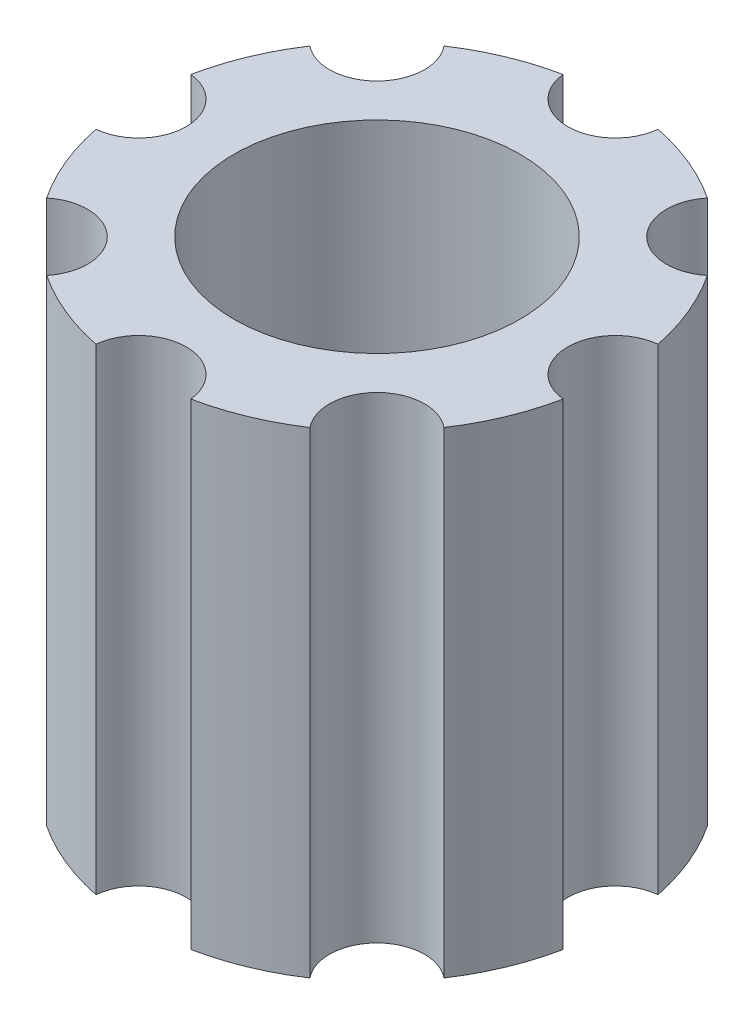
ISO-10303-21;
HEADER;
FILE_DESCRIPTION(('STEP AP214'),'2;1');
FILE_NAME('part.step','',(''),(''),'','','');
FILE_SCHEMA(('AUTOMOTIVE_DESIGN { 1 0 10303 214 1 1 1 1 }'));
ENDSEC;
DATA;
#1=APPLICATION_CONTEXT('core data for automotive mechanical design processes');
#2=APPLICATION_PROTOCOL_DEFINITION('international standard','automotive_design',2000,#1);
#3=PRODUCT_CONTEXT('',#1,'mechanical');
#4=PRODUCT('Part','Part','',(#3));
#5=PRODUCT_RELATED_PRODUCT_CATEGORY('part','',(#4));
#6=PRODUCT_DEFINITION_FORMATION('','',#4);
#7=PRODUCT_DEFINITION_CONTEXT('part definition',#1,'design');
#8=PRODUCT_DEFINITION('design','',#6,#7);
#9=PRODUCT_DEFINITION_SHAPE('','',#8);
#10=(LENGTH_UNIT() NAMED_UNIT(*) SI_UNIT(.MILLI.,.METRE.));
#11=(NAMED_UNIT(*) PLANE_ANGLE_UNIT() SI_UNIT($,.RADIAN.));
#12=(NAMED_UNIT(*) SI_UNIT($,.STERADIAN.) SOLID_ANGLE_UNIT());
#13=UNCERTAINTY_MEASURE_WITH_UNIT(LENGTH_MEASURE(1.E-05),#10,'distance_accuracy_value','');
#14=(GEOMETRIC_REPRESENTATION_CONTEXT(3) GLOBAL_UNCERTAINTY_ASSIGNED_CONTEXT((#13)) GLOBAL_UNIT_ASSIGNED_CONTEXT((#10,
#11,#12)) REPRESENTATION_CONTEXT('',''));
#15=CARTESIAN_POINT('',(0.,0.,0.));
#16=DIRECTION('',(0.,0.,1.));
#17=DIRECTION('',(1.,0.,0.));
#18=AXIS2_PLACEMENT_3D('',#15,#16,#17);
#19=CARTESIAN_POINT('',(0.,5.,0.));
#20=DIRECTION('',(0.,-1.,0.));
#21=DIRECTION('',(0.,0.,-1.));
#22=AXIS2_PLACEMENT_3D('',#19,#20,#21);
#23=CYLINDRICAL_SURFACE('',#22,2.5);
#24=CARTESIAN_POINT('',(0.,0.,0.));
#25=DIRECTION('',(0.,1.,0.));
#26=DIRECTION('',(0.,0.,1.));
#27=AXIS2_PLACEMENT_3D('',#24,#25,#26);
#28=CIRCLE('',#27,2.5);
#29=CARTESIAN_POINT('',(-2.08419279589379,0.,-1.38063043192029));
#30=VERTEX_POINT('',#29);
#31=CARTESIAN_POINT('',(-2.45,0.,-0.497493718553308));
#32=VERTEX_POINT('',#31);
#33=EDGE_CURVE('E204',#30,#32,#28,.T.);
#34=ORIENTED_EDGE('',*,*,#33,.T.);
#35=DIRECTION('',(0.,-1.,0.));
#36=VECTOR('',#35,1.);
#37=CARTESIAN_POINT('',(-2.45,5.,-0.497493718553308));
#38=LINE('',#37,#36);
#39=CARTESIAN_POINT('',(-2.45,5.,-0.497493718553308));
#40=VERTEX_POINT('',#39);
#41=EDGE_CURVE('E11',#40,#32,#38,.T.);
#42=ORIENTED_EDGE('',*,*,#41,.F.);
#43=CARTESIAN_POINT('',(0.,5.,0.));
#44=DIRECTION('',(0.,1.,0.));
#45=DIRECTION('',(0.,0.,1.));
#46=AXIS2_PLACEMENT_3D('',#43,#44,#45);
#47=CIRCLE('',#46,2.5);
#48=CARTESIAN_POINT('',(-2.08419279589379,5.,-1.38063043192029));
#49=VERTEX_POINT('',#48);
#50=EDGE_CURVE('E175',#49,#40,#47,.T.);
#51=ORIENTED_EDGE('',*,*,#50,.F.);
#52=DIRECTION('',(0.,-1.,0.));
#53=VECTOR('',#52,1.);
#54=CARTESIAN_POINT('',(-2.08419279589379,5.,-1.38063043192029));
#55=LINE('',#54,#53);
#56=EDGE_CURVE('E176',#49,#30,#55,.T.);
#57=ORIENTED_EDGE('',*,*,#56,.T.);
#58=EDGE_LOOP('',(#34,#42,#51,#57));
#59=FACE_BOUND('',#58,.T.);
#60=ADVANCED_FACE('F34',(#59),#23,.T.);
#61=CARTESIAN_POINT('',(-2.5,5.,0.));
#62=DIRECTION('',(0.,-1.,0.));
#63=DIRECTION('',(0.,0.,-1.));
#64=AXIS2_PLACEMENT_3D('',#61,#62,#63);
#65=CYLINDRICAL_SURFACE('',#64,0.5);
#66=CARTESIAN_POINT('',(-2.5,0.,0.));
#67=DIRECTION('',(0.,1.,0.));
#68=DIRECTION('',(0.,0.,1.));
#69=AXIS2_PLACEMENT_3D('',#66,#67,#68);
#70=CIRCLE('',#69,0.5);
#71=CARTESIAN_POINT('',(-2.45,0.,0.497493718553308));
#72=VERTEX_POINT('',#71);
#73=EDGE_CURVE('E207',#32,#72,#70,.F.);
#74=ORIENTED_EDGE('',*,*,#73,.T.);
#75=DIRECTION('',(0.,-1.,0.));
#76=VECTOR('',#75,1.);
#77=CARTESIAN_POINT('',(-2.45,5.,0.497493718553308));
#78=LINE('',#77,#76);
#79=CARTESIAN_POINT('',(-2.45,5.,0.497493718553308));
#80=VERTEX_POINT('',#79);
#81=EDGE_CURVE('E43',#80,#72,#78,.T.);
#82=ORIENTED_EDGE('',*,*,#81,.F.);
#83=CARTESIAN_POINT('',(-2.5,5.,0.));
#84=DIRECTION('',(0.,1.,0.));
#85=DIRECTION('',(0.,0.,1.));
#86=AXIS2_PLACEMENT_3D('',#83,#84,#85);
#87=CIRCLE('',#86,0.5);
#88=EDGE_CURVE('E118',#40,#80,#87,.F.);
#89=ORIENTED_EDGE('',*,*,#88,.F.);
#90=ORIENTED_EDGE('',*,*,#41,.T.);
#91=EDGE_LOOP('',(#74,#82,#89,#90));
#92=FACE_BOUND('',#91,.T.);
#93=ADVANCED_FACE('F325',(#92),#65,.F.);
#94=CARTESIAN_POINT('',(0.,5.,0.));
#95=DIRECTION('',(0.,-1.,0.));
#96=DIRECTION('',(0.,0.,-1.));
#97=AXIS2_PLACEMENT_3D('',#94,#95,#96);
#98=CYLINDRICAL_SURFACE('',#97,2.5);
#99=CARTESIAN_POINT('',(0.,0.,0.));
#100=DIRECTION('',(0.,1.,0.));
#101=DIRECTION('',(0.,0.,1.));
#102=AXIS2_PLACEMENT_3D('',#99,#100,#101);
#103=CIRCLE('',#102,2.5);
#104=CARTESIAN_POINT('',(-2.08419279589381,0.,1.38063043192026));
#105=VERTEX_POINT('',#104);
#106=EDGE_CURVE('E210',#72,#105,#103,.T.);
#107=ORIENTED_EDGE('',*,*,#106,.T.);
#108=DIRECTION('',(0.,-1.,0.));
#109=VECTOR('',#108,1.);
#110=CARTESIAN_POINT('',(-2.08419279589381,5.,1.38063043192026));
#111=LINE('',#110,#109);
#112=CARTESIAN_POINT('',(-2.08419279589381,5.,1.38063043192026));
#113=VERTEX_POINT('',#112);
#114=EDGE_CURVE('E258',#113,#105,#111,.T.);
#115=ORIENTED_EDGE('',*,*,#114,.F.);
#116=CARTESIAN_POINT('',(0.,5.,0.));
#117=DIRECTION('',(0.,1.,0.));
#118=DIRECTION('',(0.,0.,1.));
#119=AXIS2_PLACEMENT_3D('',#116,#117,#118);
#120=CIRCLE('',#119,2.5);
#121=EDGE_CURVE('E185',#80,#113,#120,.T.);
#122=ORIENTED_EDGE('',*,*,#121,.F.);
#123=ORIENTED_EDGE('',*,*,#81,.T.);
#124=EDGE_LOOP('',(#107,#115,#122,#123));
#125=FACE_BOUND('',#124,.T.);
#126=ADVANCED_FACE('F264',(#125),#98,.T.);
#127=CARTESIAN_POINT('',(-1.76776695296639,5.,1.76776695296635));
#128=DIRECTION('',(0.,-1.,0.));
#129=DIRECTION('',(0.,0.,-1.));
#130=AXIS2_PLACEMENT_3D('',#127,#128,#129);
#131=CYLINDRICAL_SURFACE('',#130,0.5);
#132=CARTESIAN_POINT('',(-1.76776695296639,0.,1.76776695296635));
#133=DIRECTION('',(0.,1.,0.));
#134=DIRECTION('',(0.,0.,1.));
#135=AXIS2_PLACEMENT_3D('',#132,#133,#134);
#136=CIRCLE('',#135,0.5);
#137=CARTESIAN_POINT('',(-1.38063043192031,0.,2.08419279589378));
#138=VERTEX_POINT('',#137);
#139=EDGE_CURVE('E212',#105,#138,#136,.F.);
#140=ORIENTED_EDGE('',*,*,#139,.T.);
#141=DIRECTION('',(0.,-1.,0.));
#142=VECTOR('',#141,1.);
#143=CARTESIAN_POINT('',(-1.38063043192031,5.,2.08419279589378));
#144=LINE('',#143,#142);
#145=CARTESIAN_POINT('',(-1.38063043192031,5.,2.08419279589378));
#146=VERTEX_POINT('',#145);
#147=EDGE_CURVE('E255',#146,#138,#144,.T.);
#148=ORIENTED_EDGE('',*,*,#147,.F.);
#149=CARTESIAN_POINT('',(-1.76776695296639,5.,1.76776695296635));
#150=DIRECTION('',(0.,1.,0.));
#151=DIRECTION('',(0.,0.,1.));
#152=AXIS2_PLACEMENT_3D('',#149,#150,#151);
#153=CIRCLE('',#152,0.5);
#154=EDGE_CURVE('E283',#113,#146,#153,.F.);
#155=ORIENTED_EDGE('',*,*,#154,.F.);
#156=ORIENTED_EDGE('',*,*,#114,.T.);
#157=EDGE_LOOP('',(#140,#148,#155,#156));
#158=FACE_BOUND('',#157,.T.);
#159=ADVANCED_FACE('F274',(#158),#131,.F.);
#160=CARTESIAN_POINT('',(-0.497493718553334,0.,2.44999999999999));
#161=VERTEX_POINT('',#160);
#162=EDGE_CURVE('E214',#138,#161,#103,.T.);
#163=ORIENTED_EDGE('',*,*,#162,.T.);
#164=DIRECTION('',(0.,-1.,0.));
#165=VECTOR('',#164,1.);
#166=CARTESIAN_POINT('',(-0.497493718553334,5.,2.44999999999999));
#167=LINE('',#166,#165);
#168=CARTESIAN_POINT('',(-0.497493718553334,5.,2.44999999999999));
#169=VERTEX_POINT('',#168);
#170=EDGE_CURVE('E252',#169,#161,#167,.T.);
#171=ORIENTED_EDGE('',*,*,#170,.F.);
#172=EDGE_CURVE('E280',#146,#169,#120,.T.);
#173=ORIENTED_EDGE('',*,*,#172,.F.);
#174=ORIENTED_EDGE('',*,*,#147,.T.);
#175=EDGE_LOOP('',(#163,#171,#173,#174));
#176=FACE_BOUND('',#175,.T.);
#177=ADVANCED_FACE('F278',(#176),#98,.T.);
#178=CARTESIAN_POINT('',(0.,5.,2.5));
#179=DIRECTION('',(0.,-1.,0.));
#180=DIRECTION('',(0.,0.,-1.));
#181=AXIS2_PLACEMENT_3D('',#178,#179,#180);
#182=CYLINDRICAL_SURFACE('',#181,0.5);
#183=CARTESIAN_POINT('',(0.,0.,2.5));
#184=DIRECTION('',(0.,1.,0.));
#185=DIRECTION('',(0.,0.,1.));
#186=AXIS2_PLACEMENT_3D('',#183,#184,#185);
#187=CIRCLE('',#186,0.5);
#188=CARTESIAN_POINT('',(0.497493718553282,0.,2.45000000000001));
#189=VERTEX_POINT('',#188);
#190=EDGE_CURVE('E216',#161,#189,#187,.F.);
#191=ORIENTED_EDGE('',*,*,#190,.T.);
#192=DIRECTION('',(0.,-1.,0.));
#193=VECTOR('',#192,1.);
#194=CARTESIAN_POINT('',(0.497493718553282,5.,2.45000000000001));
#195=LINE('',#194,#193);
#196=CARTESIAN_POINT('',(0.497493718553282,5.,2.45000000000001));
#197=VERTEX_POINT('',#196);
#198=EDGE_CURVE('E249',#197,#189,#195,.T.);
#199=ORIENTED_EDGE('',*,*,#198,.F.);
#200=CARTESIAN_POINT('',(0.,5.,2.5));
#201=DIRECTION('',(0.,1.,0.));
#202=DIRECTION('',(0.,0.,1.));
#203=AXIS2_PLACEMENT_3D('',#200,#201,#202);
#204=CIRCLE('',#203,0.5);
#205=EDGE_CURVE('E282',#169,#197,#204,.F.);
#206=ORIENTED_EDGE('',*,*,#205,.F.);
#207=ORIENTED_EDGE('',*,*,#170,.T.);
#208=EDGE_LOOP('',(#191,#199,#206,#207));
#209=FACE_BOUND('',#208,.T.);
#210=ADVANCED_FACE('F350',(#209),#182,.F.);
#211=CARTESIAN_POINT('',(1.38063043192027,0.,2.08419279589381));
#212=VERTEX_POINT('',#211);
#213=EDGE_CURVE('E218',#189,#212,#103,.T.);
#214=ORIENTED_EDGE('',*,*,#213,.T.);
#215=DIRECTION('',(0.,-1.,0.));
#216=VECTOR('',#215,1.);
#217=CARTESIAN_POINT('',(1.38063043192027,5.,2.08419279589381));
#218=LINE('',#217,#216);
#219=CARTESIAN_POINT('',(1.38063043192027,5.,2.08419279589381));
#220=VERTEX_POINT('',#219);
#221=EDGE_CURVE('E246',#220,#212,#218,.T.);
#222=ORIENTED_EDGE('',*,*,#221,.F.);
#223=EDGE_CURVE('E197',#197,#220,#120,.T.);
#224=ORIENTED_EDGE('',*,*,#223,.F.);
#225=ORIENTED_EDGE('',*,*,#198,.T.);
#226=EDGE_LOOP('',(#214,#222,#224,#225));
#227=FACE_BOUND('',#226,.T.);
#228=ADVANCED_FACE('F347',(#227),#98,.T.);
#229=CARTESIAN_POINT('',(1.76776695296635,5.,1.76776695296638));
#230=DIRECTION('',(0.,-1.,0.));
#231=DIRECTION('',(0.,0.,-1.));
#232=AXIS2_PLACEMENT_3D('',#229,#230,#231);
#233=CYLINDRICAL_SURFACE('',#232,0.5);
#234=CARTESIAN_POINT('',(1.76776695296635,0.,1.76776695296638));
#235=DIRECTION('',(0.,1.,0.));
#236=DIRECTION('',(0.,0.,1.));
#237=AXIS2_PLACEMENT_3D('',#234,#235,#236);
#238=CIRCLE('',#237,0.5);
#239=CARTESIAN_POINT('',(2.08419279589379,0.,1.3806304319203));
#240=VERTEX_POINT('',#239);
#241=EDGE_CURVE('E219',#212,#240,#238,.F.);
#242=ORIENTED_EDGE('',*,*,#241,.T.);
#243=DIRECTION('',(0.,-1.,0.));
#244=VECTOR('',#243,1.);
#245=CARTESIAN_POINT('',(2.08419279589379,5.,1.3806304319203));
#246=LINE('',#245,#244);
#247=CARTESIAN_POINT('',(2.08419279589379,5.,1.3806304319203));
#248=VERTEX_POINT('',#247);
#249=EDGE_CURVE('E243',#248,#240,#246,.T.);
#250=ORIENTED_EDGE('',*,*,#249,.F.);
#251=CARTESIAN_POINT('',(1.76776695296635,5.,1.76776695296638));
#252=DIRECTION('',(0.,1.,0.));
#253=DIRECTION('',(0.,0.,1.));
#254=AXIS2_PLACEMENT_3D('',#251,#252,#253);
#255=CIRCLE('',#254,0.5);
#256=EDGE_CURVE('E195',#220,#248,#255,.F.);
#257=ORIENTED_EDGE('',*,*,#256,.F.);
#258=ORIENTED_EDGE('',*,*,#221,.T.);
#259=EDGE_LOOP('',(#242,#250,#257,#258));
#260=FACE_BOUND('',#259,.T.);
#261=ADVANCED_FACE('F292',(#260),#233,.F.);
#262=CARTESIAN_POINT('',(2.45,0.,0.497493718553325));
#263=VERTEX_POINT('',#262);
#264=EDGE_CURVE('E213',#240,#263,#103,.T.);
#265=ORIENTED_EDGE('',*,*,#264,.T.);
#266=DIRECTION('',(0.,-1.,0.));
#267=VECTOR('',#266,1.);
#268=CARTESIAN_POINT('',(2.45,5.,0.497493718553325));
#269=LINE('',#268,#267);
#270=CARTESIAN_POINT('',(2.45,5.,0.497493718553325));
#271=VERTEX_POINT('',#270);
#272=EDGE_CURVE('E240',#271,#263,#269,.T.);
#273=ORIENTED_EDGE('',*,*,#272,.F.);
#274=EDGE_CURVE('E191',#248,#271,#120,.T.);
#275=ORIENTED_EDGE('',*,*,#274,.F.);
#276=ORIENTED_EDGE('',*,*,#249,.T.);
#277=EDGE_LOOP('',(#265,#273,#275,#276));
#278=FACE_BOUND('',#277,.T.);
#279=ADVANCED_FACE('F296',(#278),#98,.T.);
#280=CARTESIAN_POINT('',(2.5,5.,0.));
#281=DIRECTION('',(0.,-1.,0.));
#282=DIRECTION('',(0.,0.,-1.));
#283=AXIS2_PLACEMENT_3D('',#280,#281,#282);
#284=CYLINDRICAL_SURFACE('',#283,0.5);
#285=CARTESIAN_POINT('',(2.5,0.,0.));
#286=DIRECTION('',(0.,1.,0.));
#287=DIRECTION('',(0.,0.,1.));
#288=AXIS2_PLACEMENT_3D('',#285,#286,#287);
#289=CIRCLE('',#288,0.5);
#290=CARTESIAN_POINT('',(2.45,0.,-0.497493718553291));
#291=VERTEX_POINT('',#290);
#292=EDGE_CURVE('E221',#263,#291,#289,.F.);
#293=ORIENTED_EDGE('',*,*,#292,.T.);
#294=DIRECTION('',(0.,-1.,0.));
#295=VECTOR('',#294,1.);
#296=CARTESIAN_POINT('',(2.45,5.,-0.497493718553291));
#297=LINE('',#296,#295);
#298=CARTESIAN_POINT('',(2.45,5.,-0.497493718553291));
#299=VERTEX_POINT('',#298);
#300=EDGE_CURVE('E237',#299,#291,#297,.T.);
#301=ORIENTED_EDGE('',*,*,#300,.F.);
#302=CARTESIAN_POINT('',(2.5,5.,0.));
#303=DIRECTION('',(0.,1.,0.));
#304=DIRECTION('',(0.,0.,1.));
#305=AXIS2_PLACEMENT_3D('',#302,#303,#304);
#306=CIRCLE('',#305,0.5);
#307=EDGE_CURVE('E187',#271,#299,#306,.F.);
#308=ORIENTED_EDGE('',*,*,#307,.F.);
#309=ORIENTED_EDGE('',*,*,#272,.T.);
#310=EDGE_LOOP('',(#293,#301,#308,#309));
#311=FACE_BOUND('',#310,.T.);
#312=ADVANCED_FACE('F299',(#311),#284,.F.);
#313=CARTESIAN_POINT('',(2.0841927958938,0.,-1.38063043192028));
#314=VERTEX_POINT('',#313);
#315=EDGE_CURVE('E208',#291,#314,#28,.T.);
#316=ORIENTED_EDGE('',*,*,#315,.T.);
#317=DIRECTION('',(0.,-1.,0.));
#318=VECTOR('',#317,1.);
#319=CARTESIAN_POINT('',(2.0841927958938,5.,-1.38063043192028));
#320=LINE('',#319,#318);
#321=CARTESIAN_POINT('',(2.0841927958938,5.,-1.38063043192028));
#322=VERTEX_POINT('',#321);
#323=EDGE_CURVE('E234',#322,#314,#320,.T.);
#324=ORIENTED_EDGE('',*,*,#323,.F.);
#325=EDGE_CURVE('E181',#299,#322,#47,.T.);
#326=ORIENTED_EDGE('',*,*,#325,.F.);
#327=ORIENTED_EDGE('',*,*,#300,.T.);
#328=EDGE_LOOP('',(#316,#324,#326,#327));
#329=FACE_BOUND('',#328,.T.);
#330=ADVANCED_FACE('F302',(#329),#23,.T.);
#331=CARTESIAN_POINT('',(1.76776695296638,5.,-1.76776695296636));
#332=DIRECTION('',(0.,-1.,0.));
#333=DIRECTION('',(0.,0.,-1.));
#334=AXIS2_PLACEMENT_3D('',#331,#332,#333);
#335=CYLINDRICAL_SURFACE('',#334,0.5);
#336=CARTESIAN_POINT('',(1.76776695296638,0.,-1.76776695296636));
#337=DIRECTION('',(0.,1.,0.));
#338=DIRECTION('',(0.,0.,1.));
#339=AXIS2_PLACEMENT_3D('',#336,#337,#338);
#340=CIRCLE('',#339,0.5);
#341=CARTESIAN_POINT('',(1.3806304319203,0.,-2.08419279589379));
#342=VERTEX_POINT('',#341);
#343=EDGE_CURVE('E223',#314,#342,#340,.F.);
#344=ORIENTED_EDGE('',*,*,#343,.T.);
#345=DIRECTION('',(0.,-1.,0.));
#346=VECTOR('',#345,1.);
#347=CARTESIAN_POINT('',(1.3806304319203,5.,-2.08419279589379));
#348=LINE('',#347,#346);
#349=CARTESIAN_POINT('',(1.3806304319203,5.,-2.08419279589379));
#350=VERTEX_POINT('',#349);
#351=EDGE_CURVE('E231',#350,#342,#348,.T.);
#352=ORIENTED_EDGE('',*,*,#351,.F.);
#353=CARTESIAN_POINT('',(1.76776695296638,5.,-1.76776695296636));
#354=DIRECTION('',(0.,1.,0.));
#355=DIRECTION('',(0.,0.,1.));
#356=AXIS2_PLACEMENT_3D('',#353,#354,#355);
#357=CIRCLE('',#356,0.5);
#358=EDGE_CURVE('E180',#322,#350,#357,.F.);
#359=ORIENTED_EDGE('',*,*,#358,.F.);
#360=ORIENTED_EDGE('',*,*,#323,.T.);
#361=EDGE_LOOP('',(#344,#352,#359,#360));
#362=FACE_BOUND('',#361,.T.);
#363=ADVANCED_FACE('F307',(#362),#335,.F.);
#364=CARTESIAN_POINT('',(0.497493718553317,0.,-2.45));
#365=VERTEX_POINT('',#364);
#366=EDGE_CURVE('E225',#342,#365,#28,.T.);
#367=ORIENTED_EDGE('',*,*,#366,.T.);
#368=DIRECTION('',(0.,-1.,0.));
#369=VECTOR('',#368,1.);
#370=CARTESIAN_POINT('',(0.497493718553317,5.,-2.45));
#371=LINE('',#370,#369);
#372=CARTESIAN_POINT('',(0.497493718553317,5.,-2.45));
#373=VERTEX_POINT('',#372);
#374=EDGE_CURVE('E170',#373,#365,#371,.T.);
#375=ORIENTED_EDGE('',*,*,#374,.F.);
#376=EDGE_CURVE('E161',#350,#373,#47,.T.);
#377=ORIENTED_EDGE('',*,*,#376,.F.);
#378=ORIENTED_EDGE('',*,*,#351,.T.);
#379=EDGE_LOOP('',(#367,#375,#377,#378));
#380=FACE_BOUND('',#379,.T.);
#381=ADVANCED_FACE('F310',(#380),#23,.T.);
#382=CARTESIAN_POINT('',(0.,5.,-2.5));
#383=DIRECTION('',(0.,-1.,0.));
#384=DIRECTION('',(0.,0.,-1.));
#385=AXIS2_PLACEMENT_3D('',#382,#383,#384);
#386=CYLINDRICAL_SURFACE('',#385,0.5);
#387=CARTESIAN_POINT('',(0.,0.,-2.5));
#388=DIRECTION('',(0.,1.,0.));
#389=DIRECTION('',(0.,0.,1.));
#390=AXIS2_PLACEMENT_3D('',#387,#388,#389);
#391=CIRCLE('',#390,0.5);
#392=CARTESIAN_POINT('',(-0.497493718553299,0.,-2.45));
#393=VERTEX_POINT('',#392);
#394=EDGE_CURVE('E169',#365,#393,#391,.F.);
#395=ORIENTED_EDGE('',*,*,#394,.T.);
#396=DIRECTION('',(0.,-1.,0.));
#397=VECTOR('',#396,1.);
#398=CARTESIAN_POINT('',(-0.497493718553299,5.,-2.45));
#399=LINE('',#398,#397);
#400=CARTESIAN_POINT('',(-0.497493718553299,5.,-2.45));
#401=VERTEX_POINT('',#400);
#402=EDGE_CURVE('E166',#401,#393,#399,.T.);
#403=ORIENTED_EDGE('',*,*,#402,.F.);
#404=CARTESIAN_POINT('',(0.,5.,-2.5));
#405=DIRECTION('',(0.,1.,0.));
#406=DIRECTION('',(0.,0.,1.));
#407=AXIS2_PLACEMENT_3D('',#404,#405,#406);
#408=CIRCLE('',#407,0.5);
#409=EDGE_CURVE('E155',#373,#401,#408,.F.);
#410=ORIENTED_EDGE('',*,*,#409,.F.);
#411=ORIENTED_EDGE('',*,*,#374,.T.);
#412=EDGE_LOOP('',(#395,#403,#410,#411));
#413=FACE_BOUND('',#412,.T.);
#414=ADVANCED_FACE('F167',(#413),#386,.F.);
#415=CARTESIAN_POINT('',(-1.38063043192028,0.,-2.0841927958938));
#416=VERTEX_POINT('',#415);
#417=EDGE_CURVE('E104',#393,#416,#28,.T.);
#418=ORIENTED_EDGE('',*,*,#417,.T.);
#419=DIRECTION('',(0.,-1.,0.));
#420=VECTOR('',#419,1.);
#421=CARTESIAN_POINT('',(-1.38063043192028,5.,-2.0841927958938));
#422=LINE('',#421,#420);
#423=CARTESIAN_POINT('',(-1.38063043192028,5.,-2.0841927958938));
#424=VERTEX_POINT('',#423);
#425=EDGE_CURVE('E171',#424,#416,#422,.T.);
#426=ORIENTED_EDGE('',*,*,#425,.F.);
#427=EDGE_CURVE('E159',#401,#424,#47,.T.);
#428=ORIENTED_EDGE('',*,*,#427,.F.);
#429=ORIENTED_EDGE('',*,*,#402,.T.);
#430=EDGE_LOOP('',(#418,#426,#428,#429));
#431=FACE_BOUND('',#430,.T.);
#432=ADVANCED_FACE('F173',(#431),#23,.T.);
#433=CARTESIAN_POINT('',(0.,5.,0.));
#434=DIRECTION('',(0.,-1.,0.));
#435=DIRECTION('',(0.,0.,-1.));
#436=AXIS2_PLACEMENT_3D('',#433,#434,#435);
#437=CYLINDRICAL_SURFACE('',#436,1.5);
#438=CARTESIAN_POINT('',(0.,5.,0.));
#439=DIRECTION('',(0.,1.,0.));
#440=DIRECTION('',(0.,0.,1.));
#441=AXIS2_PLACEMENT_3D('',#438,#439,#440);
#442=CIRCLE('',#441,1.5);
#443=CARTESIAN_POINT('',(0.,5.,1.5));
#444=VERTEX_POINT('',#443);
#445=EDGE_CURVE('E182',#444,#444,#442,.T.);
#446=ORIENTED_EDGE('',*,*,#445,.T.);
#447=EDGE_LOOP('',(#446));
#448=FACE_BOUND('',#447,.T.);
#449=CARTESIAN_POINT('',(0.,0.,0.));
#450=DIRECTION('',(0.,1.,0.));
#451=DIRECTION('',(0.,0.,1.));
#452=AXIS2_PLACEMENT_3D('',#449,#450,#451);
#453=CIRCLE('',#452,1.5);
#454=CARTESIAN_POINT('',(0.,0.,1.5));
#455=VERTEX_POINT('',#454);
#456=EDGE_CURVE('E201',#455,#455,#453,.T.);
#457=ORIENTED_EDGE('',*,*,#456,.F.);
#458=EDGE_LOOP('',(#457));
#459=FACE_BOUND('',#458,.T.);
#460=ADVANCED_FACE('F36',(#448,#459),#437,.F.);
#461=CARTESIAN_POINT('',(-1.76776695296637,5.,-1.76776695296637));
#462=DIRECTION('',(0.,-1.,0.));
#463=DIRECTION('',(0.,0.,-1.));
#464=AXIS2_PLACEMENT_3D('',#461,#462,#463);
#465=CYLINDRICAL_SURFACE('',#464,0.5);
#466=CARTESIAN_POINT('',(-1.76776695296637,0.,-1.76776695296637));
#467=DIRECTION('',(0.,1.,0.));
#468=DIRECTION('',(0.,0.,1.));
#469=AXIS2_PLACEMENT_3D('',#466,#467,#468);
#470=CIRCLE('',#469,0.5);
#471=EDGE_CURVE('E110',#416,#30,#470,.F.);
#472=ORIENTED_EDGE('',*,*,#471,.T.);
#473=ORIENTED_EDGE('',*,*,#56,.F.);
#474=CARTESIAN_POINT('',(-1.76776695296637,5.,-1.76776695296637));
#475=DIRECTION('',(0.,1.,0.));
#476=DIRECTION('',(0.,0.,1.));
#477=AXIS2_PLACEMENT_3D('',#474,#475,#476);
#478=CIRCLE('',#477,0.5);
#479=EDGE_CURVE('E51',#424,#49,#478,.F.);
#480=ORIENTED_EDGE('',*,*,#479,.F.);
#481=ORIENTED_EDGE('',*,*,#425,.T.);
#482=EDGE_LOOP('',(#472,#473,#480,#481));
#483=FACE_BOUND('',#482,.T.);
#484=ADVANCED_FACE('F312',(#483),#465,.F.);
#485=CARTESIAN_POINT('',(0.,5.,0.));
#486=DIRECTION('',(0.,1.,0.));
#487=DIRECTION('',(0.,0.,1.));
#488=AXIS2_PLACEMENT_3D('',#485,#486,#487);
#489=PLANE('',#488);
#490=ORIENTED_EDGE('',*,*,#445,.F.);
#491=EDGE_LOOP('',(#490));
#492=FACE_BOUND('',#491,.T.);
#493=ORIENTED_EDGE('',*,*,#50,.T.);
#494=ORIENTED_EDGE('',*,*,#88,.T.);
#495=ORIENTED_EDGE('',*,*,#121,.T.);
#496=ORIENTED_EDGE('',*,*,#154,.T.);
#497=ORIENTED_EDGE('',*,*,#172,.T.);
#498=ORIENTED_EDGE('',*,*,#205,.T.);
#499=ORIENTED_EDGE('',*,*,#223,.T.);
#500=ORIENTED_EDGE('',*,*,#256,.T.);
#501=ORIENTED_EDGE('',*,*,#274,.T.);
#502=ORIENTED_EDGE('',*,*,#307,.T.);
#503=ORIENTED_EDGE('',*,*,#325,.T.);
#504=ORIENTED_EDGE('',*,*,#358,.T.);
#505=ORIENTED_EDGE('',*,*,#376,.T.);
#506=ORIENTED_EDGE('',*,*,#409,.T.);
#507=ORIENTED_EDGE('',*,*,#427,.T.);
#508=ORIENTED_EDGE('',*,*,#479,.T.);
#509=EDGE_LOOP('',(#493,#494,#495,#496,#497,#498,#499,#500,#501,#502,#503,#504,#505,#506,#507,#508));
#510=FACE_BOUND('',#509,.T.);
#511=ADVANCED_FACE('F157',(#492,#510),#489,.T.);
#512=CARTESIAN_POINT('',(0.,0.,0.));
#513=DIRECTION('',(0.,1.,0.));
#514=DIRECTION('',(0.,0.,1.));
#515=AXIS2_PLACEMENT_3D('',#512,#513,#514);
#516=PLANE('',#515);
#517=ORIENTED_EDGE('',*,*,#456,.T.);
#518=EDGE_LOOP('',(#517));
#519=FACE_BOUND('',#518,.T.);
#520=ORIENTED_EDGE('',*,*,#33,.F.);
#521=ORIENTED_EDGE('',*,*,#471,.F.);
#522=ORIENTED_EDGE('',*,*,#417,.F.);
#523=ORIENTED_EDGE('',*,*,#394,.F.);
#524=ORIENTED_EDGE('',*,*,#366,.F.);
#525=ORIENTED_EDGE('',*,*,#343,.F.);
#526=ORIENTED_EDGE('',*,*,#315,.F.);
#527=ORIENTED_EDGE('',*,*,#292,.F.);
#528=ORIENTED_EDGE('',*,*,#264,.F.);
#529=ORIENTED_EDGE('',*,*,#241,.F.);
#530=ORIENTED_EDGE('',*,*,#213,.F.);
#531=ORIENTED_EDGE('',*,*,#190,.F.);
#532=ORIENTED_EDGE('',*,*,#162,.F.);
#533=ORIENTED_EDGE('',*,*,#139,.F.);
#534=ORIENTED_EDGE('',*,*,#106,.F.);
#535=ORIENTED_EDGE('',*,*,#73,.F.);
#536=EDGE_LOOP('',(#520,#521,#522,#523,#524,#525,#526,#527,#528,#529,#530,#531,#532,#533,#534,#535));
#537=FACE_BOUND('',#536,.T.);
#538=ADVANCED_FACE('F269',(#519,#537),#516,.F.);
#539=CLOSED_SHELL('',(#60,#93,#126,#159,#177,#210,#228,#261,#279,#312,#330,#363,#381,#414,#432,
#460,#484,#511,#538));
#540=MANIFOLD_SOLID_BREP('B2',#539);
#541=ADVANCED_BREP_SHAPE_REPRESENTATION('',(#18,#540),#14);
#542=SHAPE_DEFINITION_REPRESENTATION(#9,#541);
ENDSEC;
END-ISO-10303-21;
